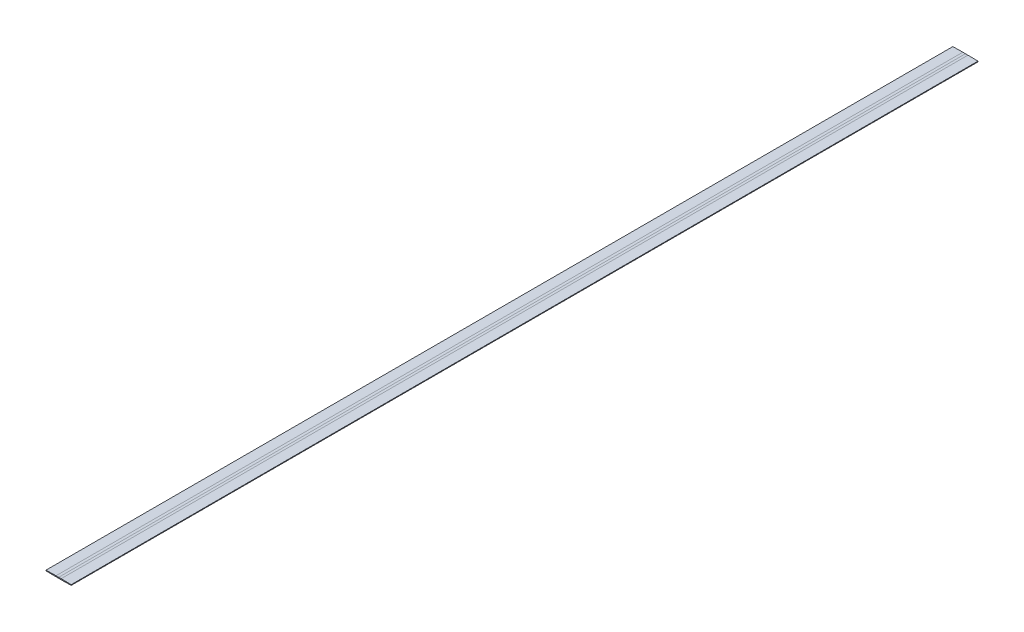
ISO-10303-21;
HEADER;
FILE_DESCRIPTION(('STEP AP214'),'2;1');
FILE_NAME('part.step','',(''),(''),'','','');
FILE_SCHEMA(('AUTOMOTIVE_DESIGN { 1 0 10303 214 1 1 1 1 }'));
ENDSEC;
DATA;
#1=APPLICATION_CONTEXT('core data for automotive mechanical design processes');
#2=APPLICATION_PROTOCOL_DEFINITION('international standard','automotive_design',2000,#1);
#3=PRODUCT_CONTEXT('',#1,'mechanical');
#4=PRODUCT('Part','Part','',(#3));
#5=PRODUCT_RELATED_PRODUCT_CATEGORY('part','',(#4));
#6=PRODUCT_DEFINITION_FORMATION('','',#4);
#7=PRODUCT_DEFINITION_CONTEXT('part definition',#1,'design');
#8=PRODUCT_DEFINITION('design','',#6,#7);
#9=PRODUCT_DEFINITION_SHAPE('','',#8);
#10=(LENGTH_UNIT() NAMED_UNIT(*) SI_UNIT(.MILLI.,.METRE.));
#11=(NAMED_UNIT(*) PLANE_ANGLE_UNIT() SI_UNIT($,.RADIAN.));
#12=(NAMED_UNIT(*) SI_UNIT($,.STERADIAN.) SOLID_ANGLE_UNIT());
#13=UNCERTAINTY_MEASURE_WITH_UNIT(LENGTH_MEASURE(1.E-05),#10,'distance_accuracy_value','');
#14=(GEOMETRIC_REPRESENTATION_CONTEXT(3) GLOBAL_UNCERTAINTY_ASSIGNED_CONTEXT((#13)) GLOBAL_UNIT_ASSIGNED_CONTEXT((#10,
#11,#12)) REPRESENTATION_CONTEXT('',''));
#15=CARTESIAN_POINT('',(0.,0.,0.));
#16=DIRECTION('',(0.,0.,1.));
#17=DIRECTION('',(1.,0.,0.));
#18=AXIS2_PLACEMENT_3D('',#15,#16,#17);
#19=CARTESIAN_POINT('',(-25.4,0.,914.4));
#20=DIRECTION('',(1.,0.,0.));
#21=DIRECTION('',(0.,0.,-1.));
#22=AXIS2_PLACEMENT_3D('',#19,#20,#21);
#23=PLANE('',#22);
#24=DIRECTION('',(0.,-1.,0.));
#25=VECTOR('',#24,1.);
#26=CARTESIAN_POINT('',(-25.4,0.,-914.4));
#27=LINE('',#26,#25);
#28=CARTESIAN_POINT('',(-25.4,0.6604,-914.4));
#29=VERTEX_POINT('',#28);
#30=CARTESIAN_POINT('',(-25.4,-0.6604,-914.4));
#31=VERTEX_POINT('',#30);
#32=EDGE_CURVE('E104',#29,#31,#27,.T.);
#33=ORIENTED_EDGE('',*,*,#32,.T.);
#34=DIRECTION('',(0.,0.,-1.));
#35=VECTOR('',#34,1.);
#36=CARTESIAN_POINT('',(-25.4,-0.6604,914.4));
#37=LINE('',#36,#35);
#38=CARTESIAN_POINT('',(-25.4,-0.6604,914.4));
#39=VERTEX_POINT('',#38);
#40=EDGE_CURVE('E11',#39,#31,#37,.T.);
#41=ORIENTED_EDGE('',*,*,#40,.F.);
#42=DIRECTION('',(0.,-1.,0.));
#43=VECTOR('',#42,1.);
#44=CARTESIAN_POINT('',(-25.4,0.,914.4));
#45=LINE('',#44,#43);
#46=CARTESIAN_POINT('',(-25.4,0.6604,914.4));
#47=VERTEX_POINT('',#46);
#48=EDGE_CURVE('E90',#47,#39,#45,.T.);
#49=ORIENTED_EDGE('',*,*,#48,.F.);
#50=DIRECTION('',(0.,0.,-1.));
#51=VECTOR('',#50,1.);
#52=CARTESIAN_POINT('',(-25.4,0.6604,914.4));
#53=LINE('',#52,#51);
#54=EDGE_CURVE('E106',#47,#29,#53,.T.);
#55=ORIENTED_EDGE('',*,*,#54,.T.);
#56=EDGE_LOOP('',(#33,#41,#49,#55));
#57=FACE_BOUND('',#56,.T.);
#58=ADVANCED_FACE('F31',(#57),#23,.F.);
#59=CARTESIAN_POINT('',(-25.4,-0.6604,914.4));
#60=DIRECTION('',(0.0163115550752127,0.999866957735392,0.));
#61=DIRECTION('',(-0.999866957735392,0.0163115550752127,0.));
#62=AXIS2_PLACEMENT_3D('',#59,#60,#61);
#63=PLANE('',#62);
#64=DIRECTION('',(0.999866957735392,-0.0163115550752127,0.));
#65=VECTOR('',#64,1.);
#66=CARTESIAN_POINT('',(-25.4,-0.6604,-914.4));
#67=LINE('',#66,#65);
#68=CARTESIAN_POINT('',(-5.159375,-0.9906,-914.4));
#69=VERTEX_POINT('',#68);
#70=EDGE_CURVE('E59',#31,#69,#67,.T.);
#71=ORIENTED_EDGE('',*,*,#70,.T.);
#72=DIRECTION('',(0.,0.,-1.));
#73=VECTOR('',#72,1.);
#74=CARTESIAN_POINT('',(-5.159375,-0.9906,914.4));
#75=LINE('',#74,#73);
#76=CARTESIAN_POINT('',(-5.159375,-0.9906,914.4));
#77=VERTEX_POINT('',#76);
#78=EDGE_CURVE('E39',#77,#69,#75,.T.);
#79=ORIENTED_EDGE('',*,*,#78,.F.);
#80=DIRECTION('',(0.999866957735392,-0.0163115550752127,0.));
#81=VECTOR('',#80,1.);
#82=CARTESIAN_POINT('',(-25.4,-0.6604,914.4));
#83=LINE('',#82,#81);
#84=EDGE_CURVE('E84',#39,#77,#83,.T.);
#85=ORIENTED_EDGE('',*,*,#84,.F.);
#86=ORIENTED_EDGE('',*,*,#40,.T.);
#87=EDGE_LOOP('',(#71,#79,#85,#86));
#88=FACE_BOUND('',#87,.T.);
#89=ADVANCED_FACE('F86',(#88),#63,.F.);
#90=CARTESIAN_POINT('',(-5.159375,-0.9906,914.4));
#91=DIRECTION('',(-0.0381261058549696,0.999272935714931,0.));
#92=DIRECTION('',(-0.999272935714931,-0.0381261058549696,0.));
#93=AXIS2_PLACEMENT_3D('',#90,#91,#92);
#94=PLANE('',#93);
#95=DIRECTION('',(0.99927293571493,0.0381261058549696,0.));
#96=VECTOR('',#95,1.);
#97=CARTESIAN_POINT('',(-5.159375,-0.9906,-914.4));
#98=LINE('',#97,#96);
#99=CARTESIAN_POINT('',(0.,-0.79375,-914.4));
#100=VERTEX_POINT('',#99);
#101=EDGE_CURVE('E102',#69,#100,#98,.T.);
#102=ORIENTED_EDGE('',*,*,#101,.T.);
#103=DIRECTION('',(0.,0.,-1.));
#104=VECTOR('',#103,1.);
#105=CARTESIAN_POINT('',(0.,-0.79375,914.4));
#106=LINE('',#105,#104);
#107=CARTESIAN_POINT('',(0.,-0.79375,914.4));
#108=VERTEX_POINT('',#107);
#109=EDGE_CURVE('E116',#108,#100,#106,.T.);
#110=ORIENTED_EDGE('',*,*,#109,.F.);
#111=DIRECTION('',(0.99927293571493,0.0381261058549696,0.));
#112=VECTOR('',#111,1.);
#113=CARTESIAN_POINT('',(-5.159375,-0.9906,914.4));
#114=LINE('',#113,#112);
#115=EDGE_CURVE('E47',#77,#108,#114,.T.);
#116=ORIENTED_EDGE('',*,*,#115,.F.);
#117=ORIENTED_EDGE('',*,*,#78,.T.);
#118=EDGE_LOOP('',(#102,#110,#116,#117));
#119=FACE_BOUND('',#118,.T.);
#120=ADVANCED_FACE('F119',(#119),#94,.F.);
#121=CARTESIAN_POINT('',(-25.4,0.,914.4));
#122=DIRECTION('',(0.,0.,-1.));
#123=DIRECTION('',(-1.,0.,0.));
#124=AXIS2_PLACEMENT_3D('',#121,#122,#123);
#125=PLANE('',#124);
#126=DIRECTION('',(0.999866957735392,0.0163115550752127,0.));
#127=VECTOR('',#126,1.);
#128=CARTESIAN_POINT('',(-25.4,0.6604,914.4));
#129=LINE('',#128,#127);
#130=CARTESIAN_POINT('',(-5.159375,0.9906,914.4));
#131=VERTEX_POINT('',#130);
#132=EDGE_CURVE('E98',#47,#131,#129,.T.);
#133=ORIENTED_EDGE('',*,*,#132,.F.);
#134=ORIENTED_EDGE('',*,*,#48,.T.);
#135=ORIENTED_EDGE('',*,*,#84,.T.);
#136=ORIENTED_EDGE('',*,*,#115,.T.);
#137=DIRECTION('',(-0.99927293571493,0.0381261058549696,0.));
#138=VECTOR('',#137,1.);
#139=CARTESIAN_POINT('',(5.159375,-0.9906,914.4));
#140=LINE('',#139,#138);
#141=CARTESIAN_POINT('',(5.159375,-0.9906,914.4));
#142=VERTEX_POINT('',#141);
#143=EDGE_CURVE('E139',#142,#108,#140,.T.);
#144=ORIENTED_EDGE('',*,*,#143,.F.);
#145=DIRECTION('',(-0.999866957735392,-0.0163115550752127,0.));
#146=VECTOR('',#145,1.);
#147=CARTESIAN_POINT('',(25.4,-0.6604,914.4));
#148=LINE('',#147,#146);
#149=CARTESIAN_POINT('',(25.4,-0.6604,914.4));
#150=VERTEX_POINT('',#149);
#151=EDGE_CURVE('E136',#150,#142,#148,.T.);
#152=ORIENTED_EDGE('',*,*,#151,.F.);
#153=DIRECTION('',(0.,-1.,0.));
#154=VECTOR('',#153,1.);
#155=CARTESIAN_POINT('',(25.4,0.,914.4));
#156=LINE('',#155,#154);
#157=CARTESIAN_POINT('',(25.4,0.6604,914.4));
#158=VERTEX_POINT('',#157);
#159=EDGE_CURVE('E130',#158,#150,#156,.T.);
#160=ORIENTED_EDGE('',*,*,#159,.F.);
#161=DIRECTION('',(-0.999866957735392,0.0163115550752127,0.));
#162=VECTOR('',#161,1.);
#163=CARTESIAN_POINT('',(25.4,0.6604,914.4));
#164=LINE('',#163,#162);
#165=CARTESIAN_POINT('',(5.159375,0.9906,914.4));
#166=VERTEX_POINT('',#165);
#167=EDGE_CURVE('E157',#158,#166,#164,.T.);
#168=ORIENTED_EDGE('',*,*,#167,.T.);
#169=DIRECTION('',(-0.99927293571493,-0.0381261058549696,0.));
#170=VECTOR('',#169,1.);
#171=CARTESIAN_POINT('',(5.159375,0.9906,914.4));
#172=LINE('',#171,#170);
#173=CARTESIAN_POINT('',(0.,0.79375,914.4));
#174=VERTEX_POINT('',#173);
#175=EDGE_CURVE('E153',#166,#174,#172,.T.);
#176=ORIENTED_EDGE('',*,*,#175,.T.);
#177=DIRECTION('',(0.99927293571493,-0.0381261058549696,0.));
#178=VECTOR('',#177,1.);
#179=CARTESIAN_POINT('',(-5.159375,0.9906,914.4));
#180=LINE('',#179,#178);
#181=EDGE_CURVE('E171',#131,#174,#180,.T.);
#182=ORIENTED_EDGE('',*,*,#181,.F.);
#183=EDGE_LOOP('',(#133,#134,#135,#136,#144,#152,#160,#168,#176,#182));
#184=FACE_BOUND('',#183,.T.);
#185=ADVANCED_FACE('F94',(#184),#125,.F.);
#186=CARTESIAN_POINT('',(-25.4,0.,-914.4));
#187=DIRECTION('',(0.,0.,-1.));
#188=DIRECTION('',(-1.,0.,0.));
#189=AXIS2_PLACEMENT_3D('',#186,#187,#188);
#190=PLANE('',#189);
#191=ORIENTED_EDGE('',*,*,#32,.F.);
#192=DIRECTION('',(0.999866957735392,0.0163115550752127,0.));
#193=VECTOR('',#192,1.);
#194=CARTESIAN_POINT('',(-25.4,0.6604,-914.4));
#195=LINE('',#194,#193);
#196=CARTESIAN_POINT('',(-5.159375,0.9906,-914.4));
#197=VERTEX_POINT('',#196);
#198=EDGE_CURVE('E169',#29,#197,#195,.T.);
#199=ORIENTED_EDGE('',*,*,#198,.T.);
#200=DIRECTION('',(0.99927293571493,-0.0381261058549696,0.));
#201=VECTOR('',#200,1.);
#202=CARTESIAN_POINT('',(-5.159375,0.9906,-914.4));
#203=LINE('',#202,#201);
#204=CARTESIAN_POINT('',(0.,0.79375,-914.4));
#205=VERTEX_POINT('',#204);
#206=EDGE_CURVE('E172',#197,#205,#203,.T.);
#207=ORIENTED_EDGE('',*,*,#206,.T.);
#208=DIRECTION('',(-0.99927293571493,-0.0381261058549696,0.));
#209=VECTOR('',#208,1.);
#210=CARTESIAN_POINT('',(5.159375,0.9906,-914.4));
#211=LINE('',#210,#209);
#212=CARTESIAN_POINT('',(5.159375,0.9906,-914.4));
#213=VERTEX_POINT('',#212);
#214=EDGE_CURVE('E154',#213,#205,#211,.T.);
#215=ORIENTED_EDGE('',*,*,#214,.F.);
#216=DIRECTION('',(-0.999866957735392,0.0163115550752127,0.));
#217=VECTOR('',#216,1.);
#218=CARTESIAN_POINT('',(25.4,0.6604,-914.4));
#219=LINE('',#218,#217);
#220=CARTESIAN_POINT('',(25.4,0.6604,-914.4));
#221=VERTEX_POINT('',#220);
#222=EDGE_CURVE('E158',#221,#213,#219,.T.);
#223=ORIENTED_EDGE('',*,*,#222,.F.);
#224=DIRECTION('',(0.,-1.,0.));
#225=VECTOR('',#224,1.);
#226=CARTESIAN_POINT('',(25.4,0.,-914.4));
#227=LINE('',#226,#225);
#228=CARTESIAN_POINT('',(25.4,-0.6604,-914.4));
#229=VERTEX_POINT('',#228);
#230=EDGE_CURVE('E128',#221,#229,#227,.T.);
#231=ORIENTED_EDGE('',*,*,#230,.T.);
#232=DIRECTION('',(-0.999866957735392,-0.0163115550752127,0.));
#233=VECTOR('',#232,1.);
#234=CARTESIAN_POINT('',(25.4,-0.6604,-914.4));
#235=LINE('',#234,#233);
#236=CARTESIAN_POINT('',(5.159375,-0.9906,-914.4));
#237=VERTEX_POINT('',#236);
#238=EDGE_CURVE('E126',#229,#237,#235,.T.);
#239=ORIENTED_EDGE('',*,*,#238,.T.);
#240=DIRECTION('',(-0.99927293571493,0.0381261058549696,0.));
#241=VECTOR('',#240,1.);
#242=CARTESIAN_POINT('',(5.159375,-0.9906,-914.4));
#243=LINE('',#242,#241);
#244=EDGE_CURVE('E124',#237,#100,#243,.T.);
#245=ORIENTED_EDGE('',*,*,#244,.T.);
#246=ORIENTED_EDGE('',*,*,#101,.F.);
#247=ORIENTED_EDGE('',*,*,#70,.F.);
#248=EDGE_LOOP('',(#191,#199,#207,#215,#223,#231,#239,#245,#246,#247));
#249=FACE_BOUND('',#248,.T.);
#250=ADVANCED_FACE('F121',(#249),#190,.T.);
#251=CARTESIAN_POINT('',(25.4,0.,914.4));
#252=DIRECTION('',(1.,0.,0.));
#253=DIRECTION('',(0.,0.,-1.));
#254=AXIS2_PLACEMENT_3D('',#251,#252,#253);
#255=PLANE('',#254);
#256=ORIENTED_EDGE('',*,*,#230,.F.);
#257=DIRECTION('',(0.,0.,-1.));
#258=VECTOR('',#257,1.);
#259=CARTESIAN_POINT('',(25.4,0.6604,914.4));
#260=LINE('',#259,#258);
#261=EDGE_CURVE('E132',#158,#221,#260,.T.);
#262=ORIENTED_EDGE('',*,*,#261,.F.);
#263=ORIENTED_EDGE('',*,*,#159,.T.);
#264=DIRECTION('',(0.,0.,-1.));
#265=VECTOR('',#264,1.);
#266=CARTESIAN_POINT('',(25.4,-0.6604,914.4));
#267=LINE('',#266,#265);
#268=EDGE_CURVE('E67',#150,#229,#267,.T.);
#269=ORIENTED_EDGE('',*,*,#268,.T.);
#270=EDGE_LOOP('',(#256,#262,#263,#269));
#271=FACE_BOUND('',#270,.T.);
#272=ADVANCED_FACE('F211',(#271),#255,.T.);
#273=CARTESIAN_POINT('',(5.159375,-0.9906,914.4));
#274=DIRECTION('',(-0.0381261058549696,-0.999272935714931,0.));
#275=DIRECTION('',(0.999272935714931,-0.0381261058549696,0.));
#276=AXIS2_PLACEMENT_3D('',#273,#274,#275);
#277=PLANE('',#276);
#278=ORIENTED_EDGE('',*,*,#244,.F.);
#279=DIRECTION('',(0.,0.,-1.));
#280=VECTOR('',#279,1.);
#281=CARTESIAN_POINT('',(5.159375,-0.9906,914.4));
#282=LINE('',#281,#280);
#283=EDGE_CURVE('E109',#142,#237,#282,.T.);
#284=ORIENTED_EDGE('',*,*,#283,.F.);
#285=ORIENTED_EDGE('',*,*,#143,.T.);
#286=ORIENTED_EDGE('',*,*,#109,.T.);
#287=EDGE_LOOP('',(#278,#284,#285,#286));
#288=FACE_BOUND('',#287,.T.);
#289=ADVANCED_FACE('F212',(#288),#277,.T.);
#290=CARTESIAN_POINT('',(25.4,-0.6604,914.4));
#291=DIRECTION('',(0.0163115550752127,-0.999866957735392,0.));
#292=DIRECTION('',(0.999866957735392,0.0163115550752127,0.));
#293=AXIS2_PLACEMENT_3D('',#290,#291,#292);
#294=PLANE('',#293);
#295=ORIENTED_EDGE('',*,*,#238,.F.);
#296=ORIENTED_EDGE('',*,*,#268,.F.);
#297=ORIENTED_EDGE('',*,*,#151,.T.);
#298=ORIENTED_EDGE('',*,*,#283,.T.);
#299=EDGE_LOOP('',(#295,#296,#297,#298));
#300=FACE_BOUND('',#299,.T.);
#301=ADVANCED_FACE('F213',(#300),#294,.T.);
#302=CARTESIAN_POINT('',(25.4,0.6604,914.4));
#303=DIRECTION('',(-0.0163115550752127,-0.999866957735392,0.));
#304=DIRECTION('',(0.999866957735392,-0.0163115550752127,0.));
#305=AXIS2_PLACEMENT_3D('',#302,#303,#304);
#306=PLANE('',#305);
#307=ORIENTED_EDGE('',*,*,#222,.T.);
#308=DIRECTION('',(0.,0.,-1.));
#309=VECTOR('',#308,1.);
#310=CARTESIAN_POINT('',(5.159375,0.9906,914.4));
#311=LINE('',#310,#309);
#312=EDGE_CURVE('E147',#166,#213,#311,.T.);
#313=ORIENTED_EDGE('',*,*,#312,.F.);
#314=ORIENTED_EDGE('',*,*,#167,.F.);
#315=ORIENTED_EDGE('',*,*,#261,.T.);
#316=EDGE_LOOP('',(#307,#313,#314,#315));
#317=FACE_BOUND('',#316,.T.);
#318=ADVANCED_FACE('F210',(#317),#306,.F.);
#319=CARTESIAN_POINT('',(5.159375,0.9906,914.4));
#320=DIRECTION('',(0.0381261058549696,-0.999272935714931,0.));
#321=DIRECTION('',(0.999272935714931,0.0381261058549696,0.));
#322=AXIS2_PLACEMENT_3D('',#319,#320,#321);
#323=PLANE('',#322);
#324=ORIENTED_EDGE('',*,*,#214,.T.);
#325=DIRECTION('',(0.,0.,-1.));
#326=VECTOR('',#325,1.);
#327=CARTESIAN_POINT('',(0.,0.79375,914.4));
#328=LINE('',#327,#326);
#329=EDGE_CURVE('E150',#174,#205,#328,.T.);
#330=ORIENTED_EDGE('',*,*,#329,.F.);
#331=ORIENTED_EDGE('',*,*,#175,.F.);
#332=ORIENTED_EDGE('',*,*,#312,.T.);
#333=EDGE_LOOP('',(#324,#330,#331,#332));
#334=FACE_BOUND('',#333,.T.);
#335=ADVANCED_FACE('F204',(#334),#323,.F.);
#336=CARTESIAN_POINT('',(-5.159375,0.9906,914.4));
#337=DIRECTION('',(0.0381261058549696,0.999272935714931,0.));
#338=DIRECTION('',(-0.999272935714931,0.0381261058549696,0.));
#339=AXIS2_PLACEMENT_3D('',#336,#337,#338);
#340=PLANE('',#339);
#341=ORIENTED_EDGE('',*,*,#206,.F.);
#342=DIRECTION('',(0.,0.,-1.));
#343=VECTOR('',#342,1.);
#344=CARTESIAN_POINT('',(-5.159375,0.9906,914.4));
#345=LINE('',#344,#343);
#346=EDGE_CURVE('E161',#131,#197,#345,.T.);
#347=ORIENTED_EDGE('',*,*,#346,.F.);
#348=ORIENTED_EDGE('',*,*,#181,.T.);
#349=ORIENTED_EDGE('',*,*,#329,.T.);
#350=EDGE_LOOP('',(#341,#347,#348,#349));
#351=FACE_BOUND('',#350,.T.);
#352=ADVANCED_FACE('F180',(#351),#340,.T.);
#353=CARTESIAN_POINT('',(-25.4,0.6604,914.4));
#354=DIRECTION('',(-0.0163115550752127,0.999866957735392,0.));
#355=DIRECTION('',(-0.999866957735392,-0.0163115550752127,0.));
#356=AXIS2_PLACEMENT_3D('',#353,#354,#355);
#357=PLANE('',#356);
#358=ORIENTED_EDGE('',*,*,#198,.F.);
#359=ORIENTED_EDGE('',*,*,#54,.F.);
#360=ORIENTED_EDGE('',*,*,#132,.T.);
#361=ORIENTED_EDGE('',*,*,#346,.T.);
#362=EDGE_LOOP('',(#358,#359,#360,#361));
#363=FACE_BOUND('',#362,.T.);
#364=ADVANCED_FACE('F189',(#363),#357,.T.);
#365=CLOSED_SHELL('',(#58,#89,#120,#185,#250,#272,#289,#301,#318,#335,#352,#364));
#366=MANIFOLD_SOLID_BREP('B2',#365);
#367=ADVANCED_BREP_SHAPE_REPRESENTATION('',(#18,#366),#14);
#368=SHAPE_DEFINITION_REPRESENTATION(#9,#367);
ENDSEC;
END-ISO-10303-21;
